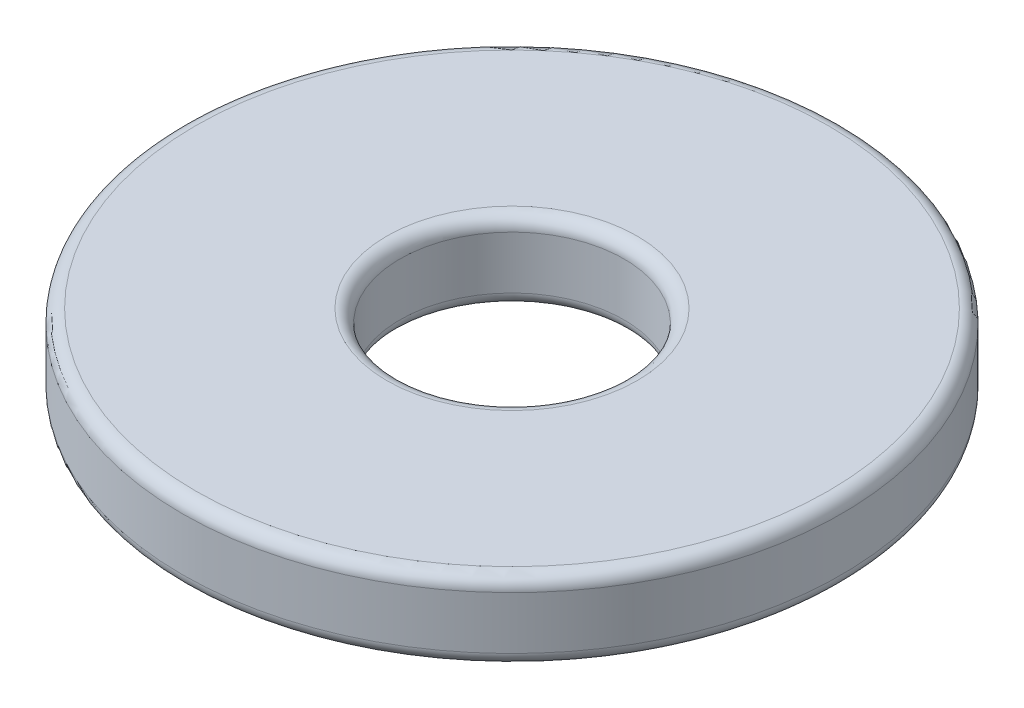
ISO-10303-21;
HEADER;
FILE_DESCRIPTION(('STEP AP214'),'2;1');
FILE_NAME('part.step','',(''),(''),'','','');
FILE_SCHEMA(('AUTOMOTIVE_DESIGN { 1 0 10303 214 1 1 1 1 }'));
ENDSEC;
DATA;
#1=APPLICATION_CONTEXT('core data for automotive mechanical design processes');
#2=APPLICATION_PROTOCOL_DEFINITION('international standard','automotive_design',2000,#1);
#3=PRODUCT_CONTEXT('',#1,'mechanical');
#4=PRODUCT('Part','Part','',(#3));
#5=PRODUCT_RELATED_PRODUCT_CATEGORY('part','',(#4));
#6=PRODUCT_DEFINITION_FORMATION('','',#4);
#7=PRODUCT_DEFINITION_CONTEXT('part definition',#1,'design');
#8=PRODUCT_DEFINITION('design','',#6,#7);
#9=PRODUCT_DEFINITION_SHAPE('','',#8);
#10=(LENGTH_UNIT() NAMED_UNIT(*) SI_UNIT(.MILLI.,.METRE.));
#11=(NAMED_UNIT(*) PLANE_ANGLE_UNIT() SI_UNIT($,.RADIAN.));
#12=(NAMED_UNIT(*) SI_UNIT($,.STERADIAN.) SOLID_ANGLE_UNIT());
#13=UNCERTAINTY_MEASURE_WITH_UNIT(LENGTH_MEASURE(1.E-05),#10,'distance_accuracy_value','');
#14=(GEOMETRIC_REPRESENTATION_CONTEXT(3) GLOBAL_UNCERTAINTY_ASSIGNED_CONTEXT((#13)) GLOBAL_UNIT_ASSIGNED_CONTEXT((#10,
#11,#12)) REPRESENTATION_CONTEXT('',''));
#15=CARTESIAN_POINT('',(0.,0.,0.));
#16=DIRECTION('',(0.,0.,1.));
#17=DIRECTION('',(1.,0.,0.));
#18=AXIS2_PLACEMENT_3D('',#15,#16,#17);
#19=CARTESIAN_POINT('',(0.,3.,0.));
#20=DIRECTION('',(0.,1.,0.));
#21=DIRECTION('',(0.,0.,1.));
#22=AXIS2_PLACEMENT_3D('',#19,#20,#21);
#23=PLANE('',#22);
#24=CARTESIAN_POINT('',(0.,3.,0.));
#25=DIRECTION('',(0.,1.,0.));
#26=DIRECTION('',(0.,0.,1.));
#27=AXIS2_PLACEMENT_3D('',#24,#25,#26);
#28=CIRCLE('',#27,12.);
#29=CARTESIAN_POINT('',(0.,3.,12.));
#30=VERTEX_POINT('',#29);
#31=EDGE_CURVE('E42',#30,#30,#28,.T.);
#32=ORIENTED_EDGE('',*,*,#31,.T.);
#33=EDGE_LOOP('',(#32));
#34=FACE_BOUND('',#33,.T.);
#35=CARTESIAN_POINT('',(0.,3.,0.));
#36=DIRECTION('',(0.,1.,0.));
#37=DIRECTION('',(0.,0.,1.));
#38=AXIS2_PLACEMENT_3D('',#35,#36,#37);
#39=CIRCLE('',#38,4.75);
#40=CARTESIAN_POINT('',(0.,3.,4.75));
#41=VERTEX_POINT('',#40);
#42=EDGE_CURVE('E46',#41,#41,#39,.F.);
#43=ORIENTED_EDGE('',*,*,#42,.T.);
#44=EDGE_LOOP('',(#43));
#45=FACE_BOUND('',#44,.T.);
#46=ADVANCED_FACE('F31',(#34,#45),#23,.T.);
#47=CARTESIAN_POINT('',(0.,0.,0.));
#48=DIRECTION('',(0.,1.,0.));
#49=DIRECTION('',(0.,0.,1.));
#50=AXIS2_PLACEMENT_3D('',#47,#48,#49);
#51=PLANE('',#50);
#52=CARTESIAN_POINT('',(0.,0.,0.));
#53=DIRECTION('',(0.,1.,0.));
#54=DIRECTION('',(0.,0.,1.));
#55=AXIS2_PLACEMENT_3D('',#52,#53,#54);
#56=CIRCLE('',#55,12.);
#57=CARTESIAN_POINT('',(0.,0.,12.));
#58=VERTEX_POINT('',#57);
#59=EDGE_CURVE('E51',#58,#58,#56,.F.);
#60=ORIENTED_EDGE('',*,*,#59,.T.);
#61=EDGE_LOOP('',(#60));
#62=FACE_BOUND('',#61,.T.);
#63=CARTESIAN_POINT('',(0.,0.,0.));
#64=DIRECTION('',(0.,1.,0.));
#65=DIRECTION('',(0.,0.,1.));
#66=AXIS2_PLACEMENT_3D('',#63,#64,#65);
#67=CIRCLE('',#66,4.75);
#68=CARTESIAN_POINT('',(0.,0.,4.75));
#69=VERTEX_POINT('',#68);
#70=EDGE_CURVE('E54',#69,#69,#67,.T.);
#71=ORIENTED_EDGE('',*,*,#70,.T.);
#72=EDGE_LOOP('',(#71));
#73=FACE_BOUND('',#72,.T.);
#74=ADVANCED_FACE('F76',(#62,#73),#51,.F.);
#75=CARTESIAN_POINT('',(0.,3.,0.));
#76=DIRECTION('',(0.,-1.,0.));
#77=DIRECTION('',(0.,0.,-1.));
#78=AXIS2_PLACEMENT_3D('',#75,#76,#77);
#79=CYLINDRICAL_SURFACE('',#78,12.5);
#80=CARTESIAN_POINT('',(0.,0.5,0.));
#81=DIRECTION('',(0.,1.,0.));
#82=DIRECTION('',(0.,0.,1.));
#83=AXIS2_PLACEMENT_3D('',#80,#81,#82);
#84=CIRCLE('',#83,12.5);
#85=CARTESIAN_POINT('',(0.,0.5,12.5));
#86=VERTEX_POINT('',#85);
#87=EDGE_CURVE('E57',#86,#86,#84,.T.);
#88=ORIENTED_EDGE('',*,*,#87,.T.);
#89=EDGE_LOOP('',(#88));
#90=FACE_BOUND('',#89,.T.);
#91=CARTESIAN_POINT('',(0.,2.5,0.));
#92=DIRECTION('',(0.,1.,0.));
#93=DIRECTION('',(0.,0.,1.));
#94=AXIS2_PLACEMENT_3D('',#91,#92,#93);
#95=CIRCLE('',#94,12.5);
#96=CARTESIAN_POINT('',(0.,2.5,12.5));
#97=VERTEX_POINT('',#96);
#98=EDGE_CURVE('E60',#97,#97,#95,.F.);
#99=ORIENTED_EDGE('',*,*,#98,.T.);
#100=EDGE_LOOP('',(#99));
#101=FACE_BOUND('',#100,.T.);
#102=ADVANCED_FACE('F64',(#90,#101),#79,.T.);
#103=CARTESIAN_POINT('',(0.,3.,0.));
#104=DIRECTION('',(0.,-1.,0.));
#105=DIRECTION('',(0.,0.,-1.));
#106=AXIS2_PLACEMENT_3D('',#103,#104,#105);
#107=CYLINDRICAL_SURFACE('',#106,4.25);
#108=CARTESIAN_POINT('',(0.,0.5,0.));
#109=DIRECTION('',(0.,1.,0.));
#110=DIRECTION('',(0.,0.,1.));
#111=AXIS2_PLACEMENT_3D('',#108,#109,#110);
#112=CIRCLE('',#111,4.25);
#113=CARTESIAN_POINT('',(0.,0.5,4.25));
#114=VERTEX_POINT('',#113);
#115=EDGE_CURVE('E10',#114,#114,#112,.F.);
#116=ORIENTED_EDGE('',*,*,#115,.T.);
#117=EDGE_LOOP('',(#116));
#118=FACE_BOUND('',#117,.T.);
#119=CARTESIAN_POINT('',(0.,2.5,0.));
#120=DIRECTION('',(0.,1.,0.));
#121=DIRECTION('',(0.,0.,1.));
#122=AXIS2_PLACEMENT_3D('',#119,#120,#121);
#123=CIRCLE('',#122,4.25);
#124=CARTESIAN_POINT('',(0.,2.5,4.25));
#125=VERTEX_POINT('',#124);
#126=EDGE_CURVE('E38',#125,#125,#123,.T.);
#127=ORIENTED_EDGE('',*,*,#126,.T.);
#128=EDGE_LOOP('',(#127));
#129=FACE_BOUND('',#128,.T.);
#130=ADVANCED_FACE('F92',(#118,#129),#107,.F.);
#131=CARTESIAN_POINT('',(0.,0.5,0.));
#132=DIRECTION('',(0.,1.,0.));
#133=DIRECTION('',(0.,0.,1.));
#134=AXIS2_PLACEMENT_3D('',#131,#132,#133);
#135=TOROIDAL_SURFACE('',#134,12.,0.5);
#136=ORIENTED_EDGE('',*,*,#59,.F.);
#137=EDGE_LOOP('',(#136));
#138=FACE_BOUND('',#137,.T.);
#139=ORIENTED_EDGE('',*,*,#87,.F.);
#140=EDGE_LOOP('',(#139));
#141=FACE_BOUND('',#140,.T.);
#142=ADVANCED_FACE('F70',(#138,#141),#135,.T.);
#143=CARTESIAN_POINT('',(0.,2.5,0.));
#144=DIRECTION('',(0.,1.,0.));
#145=DIRECTION('',(0.,0.,1.));
#146=AXIS2_PLACEMENT_3D('',#143,#144,#145);
#147=TOROIDAL_SURFACE('',#146,12.,0.5);
#148=ORIENTED_EDGE('',*,*,#98,.F.);
#149=EDGE_LOOP('',(#148));
#150=FACE_BOUND('',#149,.T.);
#151=ORIENTED_EDGE('',*,*,#31,.F.);
#152=EDGE_LOOP('',(#151));
#153=FACE_BOUND('',#152,.T.);
#154=ADVANCED_FACE('F66',(#150,#153),#147,.T.);
#155=CARTESIAN_POINT('',(0.,0.5,0.));
#156=DIRECTION('',(0.,1.,0.));
#157=DIRECTION('',(0.,0.,1.));
#158=AXIS2_PLACEMENT_3D('',#155,#156,#157);
#159=TOROIDAL_SURFACE('',#158,4.75,0.5);
#160=ORIENTED_EDGE('',*,*,#115,.F.);
#161=EDGE_LOOP('',(#160));
#162=FACE_BOUND('',#161,.T.);
#163=ORIENTED_EDGE('',*,*,#70,.F.);
#164=EDGE_LOOP('',(#163));
#165=FACE_BOUND('',#164,.T.);
#166=ADVANCED_FACE('F69',(#162,#165),#159,.T.);
#167=CARTESIAN_POINT('',(0.,2.5,0.));
#168=DIRECTION('',(0.,1.,0.));
#169=DIRECTION('',(0.,0.,1.));
#170=AXIS2_PLACEMENT_3D('',#167,#168,#169);
#171=TOROIDAL_SURFACE('',#170,4.75,0.5);
#172=ORIENTED_EDGE('',*,*,#42,.F.);
#173=EDGE_LOOP('',(#172));
#174=FACE_BOUND('',#173,.T.);
#175=ORIENTED_EDGE('',*,*,#126,.F.);
#176=EDGE_LOOP('',(#175));
#177=FACE_BOUND('',#176,.T.);
#178=ADVANCED_FACE('F33',(#174,#177),#171,.T.);
#179=CLOSED_SHELL('',(#46,#74,#102,#130,#142,#154,#166,#178));
#180=MANIFOLD_SOLID_BREP('B2',#179);
#181=ADVANCED_BREP_SHAPE_REPRESENTATION('',(#18,#180),#14);
#182=SHAPE_DEFINITION_REPRESENTATION(#9,#181);
ENDSEC;
END-ISO-10303-21;
